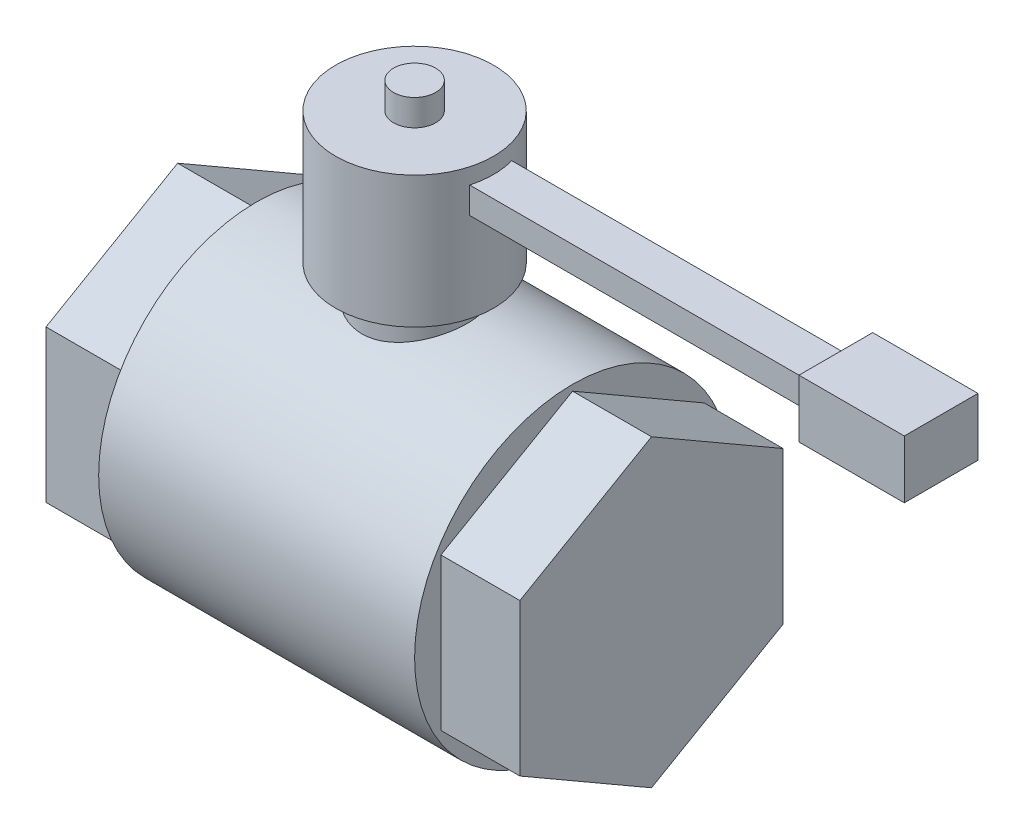
ISO-10303-21;
HEADER;
FILE_DESCRIPTION(('STEP AP214'),'2;1');
FILE_NAME('part.step','',(''),(''),'','','');
FILE_SCHEMA(('AUTOMOTIVE_DESIGN { 1 0 10303 214 1 1 1 1 }'));
ENDSEC;
DATA;
#1=APPLICATION_CONTEXT('core data for automotive mechanical design processes');
#2=APPLICATION_PROTOCOL_DEFINITION('international standard','automotive_design',2000,#1);
#3=PRODUCT_CONTEXT('',#1,'mechanical');
#4=PRODUCT('Part','Part','',(#3));
#5=PRODUCT_RELATED_PRODUCT_CATEGORY('part','',(#4));
#6=PRODUCT_DEFINITION_FORMATION('','',#4);
#7=PRODUCT_DEFINITION_CONTEXT('part definition',#1,'design');
#8=PRODUCT_DEFINITION('design','',#6,#7);
#9=PRODUCT_DEFINITION_SHAPE('','',#8);
#10=(LENGTH_UNIT() NAMED_UNIT(*) SI_UNIT(.MILLI.,.METRE.));
#11=(NAMED_UNIT(*) PLANE_ANGLE_UNIT() SI_UNIT($,.RADIAN.));
#12=(NAMED_UNIT(*) SI_UNIT($,.STERADIAN.) SOLID_ANGLE_UNIT());
#13=UNCERTAINTY_MEASURE_WITH_UNIT(LENGTH_MEASURE(1.E-05),#10,'distance_accuracy_value','');
#14=(GEOMETRIC_REPRESENTATION_CONTEXT(3) GLOBAL_UNCERTAINTY_ASSIGNED_CONTEXT((#13)) GLOBAL_UNIT_ASSIGNED_CONTEXT((#10,
#11,#12)) REPRESENTATION_CONTEXT('',''));
#15=CARTESIAN_POINT('',(0.,0.,0.));
#16=DIRECTION('',(0.,0.,1.));
#17=DIRECTION('',(1.,0.,0.));
#18=AXIS2_PLACEMENT_3D('',#15,#16,#17);
#19=CARTESIAN_POINT('',(-30.,60.,0.));
#20=DIRECTION('',(0.,-1.,0.));
#21=DIRECTION('',(0.,0.,-1.));
#22=AXIS2_PLACEMENT_3D('',#19,#20,#21);
#23=CYLINDRICAL_SURFACE('',#22,15.);
#24=CARTESIAN_POINT('',(-30.,35.,0.));
#25=DIRECTION('',(0.,1.,0.));
#26=DIRECTION('',(0.,0.,1.));
#27=AXIS2_PLACEMENT_3D('',#24,#25,#26);
#28=CIRCLE('',#27,15.);
#29=CARTESIAN_POINT('',(-30.,35.,15.));
#30=VERTEX_POINT('',#29);
#31=EDGE_CURVE('E234',#30,#30,#28,.T.);
#32=ORIENTED_EDGE('',*,*,#31,.T.);
#33=EDGE_LOOP('',(#32));
#34=FACE_BOUND('',#33,.T.);
#35=CARTESIAN_POINT('',(-30.,60.,0.));
#36=DIRECTION('',(0.,1.,0.));
#37=DIRECTION('',(0.,0.,1.));
#38=AXIS2_PLACEMENT_3D('',#35,#36,#37);
#39=CIRCLE('',#38,15.);
#40=CARTESIAN_POINT('',(-30.,60.,15.));
#41=VERTEX_POINT('',#40);
#42=EDGE_CURVE('E237',#41,#41,#39,.T.);
#43=ORIENTED_EDGE('',*,*,#42,.F.);
#44=EDGE_LOOP('',(#43));
#45=FACE_BOUND('',#44,.T.);
#46=DIRECTION('',(0.,-1.,0.));
#47=VECTOR('',#46,1.);
#48=CARTESIAN_POINT('',(-15.543167705199,60.,4.));
#49=LINE('',#48,#47);
#50=CARTESIAN_POINT('',(-15.543167705199,57.,4.));
#51=VERTEX_POINT('',#50);
#52=CARTESIAN_POINT('',(-15.543167705199,52.,4.));
#53=VERTEX_POINT('',#52);
#54=EDGE_CURVE('E45',#51,#53,#49,.T.);
#55=ORIENTED_EDGE('',*,*,#54,.F.);
#56=CARTESIAN_POINT('',(-30.,57.,0.));
#57=DIRECTION('',(0.,-1.,0.));
#58=DIRECTION('',(0.,0.,-1.));
#59=AXIS2_PLACEMENT_3D('',#56,#57,#58);
#60=CIRCLE('',#59,15.);
#61=CARTESIAN_POINT('',(-15.543167705199,57.,-4.));
#62=VERTEX_POINT('',#61);
#63=EDGE_CURVE('E350',#62,#51,#60,.T.);
#64=ORIENTED_EDGE('',*,*,#63,.F.);
#65=DIRECTION('',(0.,-1.,0.));
#66=VECTOR('',#65,1.);
#67=CARTESIAN_POINT('',(-15.543167705199,60.,-4.));
#68=LINE('',#67,#66);
#69=CARTESIAN_POINT('',(-15.543167705199,52.,-4.));
#70=VERTEX_POINT('',#69);
#71=EDGE_CURVE('E430',#70,#62,#68,.F.);
#72=ORIENTED_EDGE('',*,*,#71,.F.);
#73=CARTESIAN_POINT('',(-30.,52.,0.));
#74=DIRECTION('',(0.,1.,0.));
#75=DIRECTION('',(0.,0.,1.));
#76=AXIS2_PLACEMENT_3D('',#73,#74,#75);
#77=CIRCLE('',#76,15.);
#78=EDGE_CURVE('E424',#53,#70,#77,.T.);
#79=ORIENTED_EDGE('',*,*,#78,.F.);
#80=EDGE_LOOP('',(#55,#64,#72,#79));
#81=FACE_BOUND('',#80,.T.);
#82=ADVANCED_FACE('F37',(#34,#45,#81),#23,.T.);
#83=CARTESIAN_POINT('',(-30.,60.,0.));
#84=DIRECTION('',(0.,1.,0.));
#85=DIRECTION('',(0.,0.,1.));
#86=AXIS2_PLACEMENT_3D('',#83,#84,#85);
#87=PLANE('',#86);
#88=ORIENTED_EDGE('',*,*,#42,.T.);
#89=EDGE_LOOP('',(#88));
#90=FACE_BOUND('',#89,.T.);
#91=CARTESIAN_POINT('',(-30.,60.,0.));
#92=DIRECTION('',(0.,1.,0.));
#93=DIRECTION('',(0.,0.,1.));
#94=AXIS2_PLACEMENT_3D('',#91,#92,#93);
#95=CIRCLE('',#94,4.00000000000001);
#96=CARTESIAN_POINT('',(-30.,60.,4.));
#97=VERTEX_POINT('',#96);
#98=EDGE_CURVE('E230',#97,#97,#95,.T.);
#99=ORIENTED_EDGE('',*,*,#98,.F.);
#100=EDGE_LOOP('',(#99));
#101=FACE_BOUND('',#100,.T.);
#102=ADVANCED_FACE('F407',(#90,#101),#87,.T.);
#103=CARTESIAN_POINT('',(-60.,0.,0.));
#104=DIRECTION('',(1.,0.,0.));
#105=DIRECTION('',(0.,0.,-1.));
#106=AXIS2_PLACEMENT_3D('',#103,#104,#105);
#107=CYLINDRICAL_SURFACE('',#106,30.);
#108=CARTESIAN_POINT('',(0.,0.,0.));
#109=DIRECTION('',(-1.,0.,0.));
#110=DIRECTION('',(0.,0.,1.));
#111=AXIS2_PLACEMENT_3D('',#108,#109,#110);
#112=CIRCLE('',#111,30.);
#113=CARTESIAN_POINT('',(0.,0.,30.));
#114=VERTEX_POINT('',#113);
#115=EDGE_CURVE('E288',#114,#114,#112,.T.);
#116=ORIENTED_EDGE('',*,*,#115,.T.);
#117=EDGE_LOOP('',(#116));
#118=FACE_BOUND('',#117,.T.);
#119=CARTESIAN_POINT('',(-60.,0.,0.));
#120=DIRECTION('',(-1.,0.,0.));
#121=DIRECTION('',(0.,0.,1.));
#122=AXIS2_PLACEMENT_3D('',#119,#120,#121);
#123=CIRCLE('',#122,30.);
#124=CARTESIAN_POINT('',(-60.,0.,30.));
#125=VERTEX_POINT('',#124);
#126=EDGE_CURVE('E289',#125,#125,#123,.T.);
#127=ORIENTED_EDGE('',*,*,#126,.F.);
#128=EDGE_LOOP('',(#127));
#129=FACE_BOUND('',#128,.T.);
#130=CARTESIAN_POINT('',(-30.,28.2842712474619,-10.));
#131=CARTESIAN_POINT('',(-30.2723418794484,28.2842711586537,-10.0000001140375));
#132=CARTESIAN_POINT('',(-30.5446821013665,28.2882153633986,-9.98886524893431));
#133=CARTESIAN_POINT('',(-31.0873201569934,28.303863864854,-9.94443775454981));
#134=CARTESIAN_POINT('',(-31.3576180054255,28.3155681055686,-9.91114528515617));
#135=CARTESIAN_POINT('',(-31.8942210460498,28.3463631817862,-9.82272262727794));
#136=CARTESIAN_POINT('',(-32.1605257092147,28.3654549871867,-9.76758957136718));
#137=CARTESIAN_POINT('',(-32.6872225140072,28.4104260085242,-9.63600126034046));
#138=CARTESIAN_POINT('',(-32.9476146047763,28.4363052828214,-9.55954582188961));
#139=CARTESIAN_POINT('',(-33.4601649850302,28.4939998192804,-9.38617562291736));
#140=CARTESIAN_POINT('',(-33.7123400970215,28.5258019239445,-9.28930615037564));
#141=CARTESIAN_POINT('',(-34.2075458741649,28.594462376809,-9.07575323466854));
#142=CARTESIAN_POINT('',(-34.4505731043534,28.6313226006317,-8.95906243763903));
#143=CARTESIAN_POINT('',(-34.9259128050748,28.7090513785684,-8.70676649822042));
#144=CARTESIAN_POINT('',(-35.1582256786273,28.749919781734,-8.57116206803915));
#145=CARTESIAN_POINT('',(-35.610819611248,28.8345602147077,-8.28195822303537));
#146=CARTESIAN_POINT('',(-35.8310999350429,28.8783324215974,-8.12835771032556));
#147=CARTESIAN_POINT('',(-36.2659723967076,28.969218118448,-7.798378664126));
#148=CARTESIAN_POINT('',(-36.4800846696936,29.0163950635917,-7.62138490453672));
#149=CARTESIAN_POINT('',(-36.8927827349914,29.1113399914068,-7.25028001156654));
#150=CARTESIAN_POINT('',(-37.0913682311173,29.1591079853326,-7.05616855180183));
#151=CARTESIAN_POINT('',(-37.4718262063634,29.2539610336928,-6.65198113288573));
#152=CARTESIAN_POINT('',(-37.6536957650044,29.3010459675826,-6.44190239572426));
#153=CARTESIAN_POINT('',(-37.999507438662,29.3932703717309,-6.00708268197571));
#154=CARTESIAN_POINT('',(-38.1634500891393,29.4384099000727,-5.78234214364379));
#155=CARTESIAN_POINT('',(-38.4763726217723,29.5266957482027,-5.31343875376167));
#156=CARTESIAN_POINT('',(-38.6248433632185,29.5697580123815,-5.06891983241567));
#157=CARTESIAN_POINT('',(-38.9005121686635,29.6513369329531,-4.56756881728999));
#158=CARTESIAN_POINT('',(-39.0277186271821,29.6898553813361,-4.31074163421874));
#159=CARTESIAN_POINT('',(-39.2598596183403,29.7612633479985,-3.78644812030809));
#160=CARTESIAN_POINT('',(-39.3647941395875,29.7941528633985,-3.51898178402669));
#161=CARTESIAN_POINT('',(-39.5514314448541,29.8533415547454,-2.97535495188021));
#162=CARTESIAN_POINT('',(-39.6331352235978,29.8796410128683,-2.6991948288397));
#163=CARTESIAN_POINT('',(-39.7700936859465,29.9240820045263,-2.15001211988425));
#164=CARTESIAN_POINT('',(-39.8261696288596,29.9424755162849,-1.87721461619439));
#165=CARTESIAN_POINT('',(-39.9154055713305,29.9718782846619,-1.32750200396553));
#166=CARTESIAN_POINT('',(-39.9485660547191,29.982887697186,-1.05058698248878));
#167=CARTESIAN_POINT('',(-39.9916376695668,29.997206705667,-0.494817637017567));
#168=CARTESIAN_POINT('',(-40.0015539546129,30.0005180084087,-0.215963756651264));
#169=CARTESIAN_POINT('',(-39.9980515692161,29.9993505006877,0.341577814177324));
#170=CARTESIAN_POINT('',(-39.9846334390276,29.9948718705828,0.620265508337825));
#171=CARTESIAN_POINT('',(-39.9355842762636,29.9785811916691,1.16440400781504));
#172=CARTESIAN_POINT('',(-39.9008464957939,29.9670641183686,1.42994475599843));
#173=CARTESIAN_POINT('',(-39.8102808468664,29.9372641152287,1.95700946299872));
#174=CARTESIAN_POINT('',(-39.754453629906,29.9189813943948,2.21853354563925));
#175=CARTESIAN_POINT('',(-39.6222095953314,29.8761277515145,2.73574967788115));
#176=CARTESIAN_POINT('',(-39.5457956920147,29.8515577195385,2.99144254740937));
#177=CARTESIAN_POINT('',(-39.3729812172166,29.7967458585561,3.49545812020525));
#178=CARTESIAN_POINT('',(-39.2765730714632,29.7665018805458,3.74377798954211));
#179=CARTESIAN_POINT('',(-39.0631917994555,29.7006905364675,4.23450728965929));
#180=CARTESIAN_POINT('',(-38.9459722462019,29.6650602399235,4.4768010652609));
#181=CARTESIAN_POINT('',(-38.6926596962516,29.5896554948147,4.95074703653144));
#182=CARTESIAN_POINT('',(-38.5565597406014,29.5498795195829,5.18239526635339));
#183=CARTESIAN_POINT('',(-38.2664583434768,29.467185279309,5.63361428175612));
#184=CARTESIAN_POINT('',(-38.1124561366853,29.4242668799581,5.85318455041525));
#185=CARTESIAN_POINT('',(-37.7875470054384,29.3363500324178,6.27899992233789));
#186=CARTESIAN_POINT('',(-37.6166394655278,29.2913515085312,6.48524454001579));
#187=CARTESIAN_POINT('',(-37.2504812155572,29.198230563107,6.89268066334408));
#188=CARTESIAN_POINT('',(-37.0544610532442,29.150061110167,7.09317055422095));
#189=CARTESIAN_POINT('',(-36.6463400613069,29.0539933119105,7.47693750407163));
#190=CARTESIAN_POINT('',(-36.4342459481895,29.0060948622484,7.66022168157001));
#191=CARTESIAN_POINT('',(-35.9950753647007,28.911847334422,8.00859996283032));
#192=CARTESIAN_POINT('',(-35.7679902657065,28.8654991721175,8.17368344194966));
#193=CARTESIAN_POINT('',(-35.3004330666849,28.775718676331,8.4843478027125));
#194=CARTESIAN_POINT('',(-35.0599663269053,28.7322851904866,8.62993641488595));
#195=CARTESIAN_POINT('',(-34.5634279368337,28.64898095839,8.90261331003136));
#196=CARTESIAN_POINT('',(-34.3071784802907,28.6091721838022,9.02939717143143));
#197=CARTESIAN_POINT('',(-33.7841885696666,28.5351208009343,9.26075808434889));
#198=CARTESIAN_POINT('',(-33.5174525258998,28.5008758831323,9.36534435549717));
#199=CARTESIAN_POINT('',(-32.9753195591193,28.439058164449,9.55141833409385));
#200=CARTESIAN_POINT('',(-32.699923754345,28.4114845060698,9.63290901039166));
#201=CARTESIAN_POINT('',(-32.1425234064101,28.3639441097449,9.77200545725045));
#202=CARTESIAN_POINT('',(-31.8605192048755,28.3439769794908,9.8296124596308));
#203=CARTESIAN_POINT('',(-31.3049734673768,28.3130630141317,9.9182943720193));
#204=CARTESIAN_POINT('',(-31.0316243645171,28.3017497645433,9.95044933424631));
#205=CARTESIAN_POINT('',(-30.4829950763864,28.287066021394,9.99211639711498));
#206=CARTESIAN_POINT('',(-30.2077149493872,28.2836952891803,10.0016291780981));
#207=CARTESIAN_POINT('',(-29.6573740214749,28.2850080810155,9.9979157921081));
#208=CARTESIAN_POINT('',(-29.3823131922071,28.2896902973743,9.98469331703369));
#209=CARTESIAN_POINT('',(-28.8344674952236,28.3069515740732,9.9356512804711));
#210=CARTESIAN_POINT('',(-28.5616825995672,28.3195305373233,9.89983199680915));
#211=CARTESIAN_POINT('',(-28.0298042567512,28.3516074081319,9.80758102183027));
#212=CARTESIAN_POINT('',(-27.7705637013315,28.3708507880741,9.75190561796518));
#213=CARTESIAN_POINT('',(-27.2577495174967,28.4157468336444,9.62029948519906));
#214=CARTESIAN_POINT('',(-27.0041779311515,28.4414017695639,9.54436158082836));
#215=CARTESIAN_POINT('',(-26.5044799532182,28.4983692386223,9.37289185459437));
#216=CARTESIAN_POINT('',(-26.2583517989269,28.529680419844,9.27736471408097));
#217=CARTESIAN_POINT('',(-25.7748737754284,28.597103970113,9.0674030758055));
#218=CARTESIAN_POINT('',(-25.5375273417895,28.6332181933345,8.95296127203323));
#219=CARTESIAN_POINT('',(-25.0658014476826,28.710459557941,8.70214104644034));
#220=CARTESIAN_POINT('',(-24.8317473188572,28.7517082135721,8.56518817614671));
#221=CARTESIAN_POINT('',(-24.3758018385612,28.8371535148024,8.27295319484451));
#222=CARTESIAN_POINT('',(-24.1539159958621,28.8813514758506,8.11766288088269));
#223=CARTESIAN_POINT('',(-23.7236756816311,28.9715031084024,7.78979500724484));
#224=CARTESIAN_POINT('',(-23.5153217343163,29.0174568478141,7.61721677850365));
#225=CARTESIAN_POINT('',(-23.1133393005839,29.1099265934175,7.25582239580804));
#226=CARTESIAN_POINT('',(-22.9197111556612,29.1564426126195,7.06700586549977));
#227=CARTESIAN_POINT('',(-22.5393176180589,29.2510891603461,6.66472112704177));
#228=CARTESIAN_POINT('',(-22.3533374618238,29.2991889216562,6.45050221786745));
#229=CARTESIAN_POINT('',(-22.0001149407249,29.3933527827565,6.00684695000576));
#230=CARTESIAN_POINT('',(-21.8328658410932,29.4394176105782,5.77741610832449));
#231=CARTESIAN_POINT('',(-21.5181558106606,29.5282725260609,5.30461980440384));
#232=CARTESIAN_POINT('',(-21.3707026844815,29.5710613192953,5.06124889988544));
#233=CARTESIAN_POINT('',(-21.0968569085151,29.6521306466086,4.56234364098344));
#234=CARTESIAN_POINT('',(-20.970455395478,29.6904130759775,4.30681446409061));
#235=CARTESIAN_POINT('',(-20.7404305230089,29.7611781009394,3.78690590920505));
#236=CARTESIAN_POINT('',(-20.6366666176068,29.7936962331654,3.52259360643661));
#237=CARTESIAN_POINT('',(-20.4518195802299,29.8523040878082,2.98545108537337));
#238=CARTESIAN_POINT('',(-20.3707364736991,29.8783938030133,2.71262085752323));
#239=CARTESIAN_POINT('',(-20.2320439705428,29.9233798042343,2.16055813778271));
#240=CARTESIAN_POINT('',(-20.1744275615284,29.9422782390591,1.88132758484044));
#241=CARTESIAN_POINT('',(-20.0832142576388,29.9723335559029,1.31856201646018));
#242=CARTESIAN_POINT('',(-20.0496163286901,29.983490771206,1.03502718687206));
#243=CARTESIAN_POINT('',(-20.0077927119217,29.9973972888662,0.479319262582846));
#244=CARTESIAN_POINT('',(-19.9984478955139,30.0005173987915,0.20723908105294));
#245=CARTESIAN_POINT('',(-20.0019714741259,29.9993428126327,-0.336755914294548));
#246=CARTESIAN_POINT('',(-20.0148391277196,29.9950483640377,-0.608670733328677));
#247=CARTESIAN_POINT('',(-20.0626613555054,29.9791626520563,-1.15030993875714));
#248=CARTESIAN_POINT('',(-20.0976141388509,29.9675719803088,-1.42003450095977));
#249=CARTESIAN_POINT('',(-20.1892760283218,29.9374086079629,-1.95536187856338));
#250=CARTESIAN_POINT('',(-20.2459851902558,29.9188358894545,-2.22096468338958));
#251=CARTESIAN_POINT('',(-20.3795575535406,29.8755584356358,-2.74194020770653));
#252=CARTESIAN_POINT('',(-20.4560810580551,29.8509573983983,-2.99740882399659));
#253=CARTESIAN_POINT('',(-20.6290813713709,29.7960968484284,-3.50096941131779));
#254=CARTESIAN_POINT('',(-20.7255652896824,29.7658353199086,-3.7490587178722));
#255=CARTESIAN_POINT('',(-20.9377063033215,29.7004207309351,-4.23620216269844));
#256=CARTESIAN_POINT('',(-21.0533620444964,29.6652680159862,-4.47525693763802));
#257=CARTESIAN_POINT('',(-21.3030139795065,29.5909339126644,-4.94294527905783));
#258=CARTESIAN_POINT('',(-21.4370113601066,29.551752263647,-5.1715781699306));
#259=CARTESIAN_POINT('',(-21.7277108863564,29.4688081519004,-5.62534353485784));
#260=CARTESIAN_POINT('',(-21.8850687990776,29.4249299528017,-5.85003487702622));
#261=CARTESIAN_POINT('',(-22.2174631447937,29.3350010427051,-6.28547126835551));
#262=CARTESIAN_POINT('',(-22.3924999321698,29.2889502881672,-6.49621603781055));
#263=CARTESIAN_POINT('',(-22.7591991680803,29.1958514949471,-6.90258840131869));
#264=CARTESIAN_POINT('',(-22.9508666337529,29.148803158572,-7.09821139954937));
#265=CARTESIAN_POINT('',(-23.3496217678836,29.0549477346299,-7.47310912970469));
#266=CARTESIAN_POINT('',(-23.5567093046823,29.0081406450066,-7.65238400118341));
#267=CARTESIAN_POINT('',(-23.9935507015225,28.914186301541,-8.00022249753155));
#268=CARTESIAN_POINT('',(-24.2238763492309,28.8670984170591,-8.16808498152002));
#269=CARTESIAN_POINT('',(-24.6983400025417,28.7759175566601,-8.48372301205399));
#270=CARTESIAN_POINT('',(-24.9424728089149,28.7318234669818,-8.63150604933306));
#271=CARTESIAN_POINT('',(-25.4430577217519,28.6479466892045,-8.90593894197784));
#272=CARTESIAN_POINT('',(-25.6995098377129,28.6081640044294,-9.03258878105097));
#273=CARTESIAN_POINT('',(-26.2229973529307,28.5341661028133,-9.26369799840207));
#274=CARTESIAN_POINT('',(-26.4900321839124,28.4999505875266,-9.36815856629792));
#275=CARTESIAN_POINT('',(-27.0205145149407,28.439603815985,-9.54974733148494));
#276=CARTESIAN_POINT('',(-27.2835787908005,28.4131771013528,-9.62789736827418));
#277=CARTESIAN_POINT('',(-27.8158133997925,28.3672416792722,-9.76241059985781));
#278=CARTESIAN_POINT('',(-28.0849835205205,28.3477327315668,-9.8187745512985));
#279=CARTESIAN_POINT('',(-28.6274076768933,28.3162626414064,-9.90916574585985));
#280=CARTESIAN_POINT('',(-28.9006604964561,28.304299295539,-9.94319950979859));
#281=CARTESIAN_POINT('',(-29.4492761144348,28.2883036592247,-9.98861653420382));
#282=CARTESIAN_POINT('',(-29.72463890446,28.2842713372547,-9.99999988469829));
#283=CARTESIAN_POINT('',(-30.,28.2842712474619,-10.));
#284=B_SPLINE_CURVE_WITH_KNOTS('',3,(#130,#131,#132,#133,#134,#135,#136,#137,#138,#139,#140,
#141,#142,#143,#144,#145,#146,#147,#148,#149,#150,#151,#152,#153,#154,#155,#156,#157,#158,#159,
#160,#161,#162,#163,#164,#165,#166,#167,#168,#169,#170,#171,#172,#173,#174,#175,#176,#177,#178,
#179,#180,#181,#182,#183,#184,#185,#186,#187,#188,#189,#190,#191,#192,#193,#194,#195,#196,#197,
#198,#199,#200,#201,#202,#203,#204,#205,#206,#207,#208,#209,#210,#211,#212,#213,#214,#215,#216,
#217,#218,#219,#220,#221,#222,#223,#224,#225,#226,#227,#228,#229,#230,#231,#232,#233,#234,#235,
#236,#237,#238,#239,#240,#241,#242,#243,#244,#245,#246,#247,#248,#249,#250,#251,#252,#253,#254,
#255,#256,#257,#258,#259,#260,#261,#262,#263,#264,#265,#266,#267,#268,#269,#270,#271,#272,#273,
#274,#275,#276,#277,#278,#279,#280,#281,#282,#283),.UNSPECIFIED.,.T.,.F.,(4,2,2,2,2,2,2,2,2,2,2,
2,2,2,2,2,2,2,2,2,2,2,2,2,2,2,2,2,2,2,2,2,2,2,2,2,2,2,2,2,2,2,2,2,2,2,2,2,2,2,2,2,2,2,2,2,2,2,2,
2,2,2,2,2,2,2,2,2,2,2,2,2,2,2,2,2,4),(0.,0.816768059607217,1.63353022553851,2.4503996588184,
3.26727611595184,4.08235908130451,4.89774511187016,5.71310044671446,6.52850554988107,
7.37286999592243,8.21725054497379,9.06177833834293,9.90628089953094,10.7730733994816,
11.6395229027309,12.5059728491808,13.3723856892507,14.208656653563,15.0449099605402,
15.8809778400841,16.7170263626666,17.5202339571185,18.3234167408122,19.1264858838399,
19.9298598051697,20.74347212296,21.5573851233426,22.3713329311248,23.1853103823888,
24.0378278398089,24.889991015934,25.7426490367816,26.5949679354003,27.459853568185,
28.3243792700685,29.1887937900586,30.0531637216384,30.8785251225923,31.7038617231671,
32.5290643128742,33.3542567569691,34.1508897973456,34.9478053211232,35.7445306229922,
36.5415643916546,37.3635426098909,38.1858899294866,39.0082690873153,39.8306673105009,
40.6928533438219,41.5547283753545,42.4169422120339,43.2787921126043,44.1351284875122,
44.9914658230858,45.8475470772925,46.7035914722059,47.5193689812693,48.3351192611683,
49.1508034017132,49.9664896346322,50.7690241262024,51.5718449585706,52.3746091098772,
53.1774252272562,54.009891165582,54.8423737943937,55.6751084453734,56.507835987135,
57.3734004329109,58.2386410839164,59.1038824019739,59.9690773207395,60.795173483065,
61.621240951903,62.44706708663,63.2728899389621),.UNSPECIFIED.);
#285=CARTESIAN_POINT('',(-30.,28.2842712474619,-10.));
#286=VERTEX_POINT('',#285);
#287=EDGE_CURVE('E343',#286,#286,#284,.T.);
#288=ORIENTED_EDGE('',*,*,#287,.F.);
#289=EDGE_LOOP('',(#288));
#290=FACE_BOUND('',#289,.T.);
#291=ADVANCED_FACE('F352',(#118,#129,#290),#107,.T.);
#292=CARTESIAN_POINT('',(-60.,0.,0.));
#293=DIRECTION('',(-1.,0.,0.));
#294=DIRECTION('',(0.,0.,1.));
#295=AXIS2_PLACEMENT_3D('',#292,#293,#294);
#296=PLANE('',#295);
#297=ORIENTED_EDGE('',*,*,#126,.T.);
#298=EDGE_LOOP('',(#297));
#299=FACE_BOUND('',#298,.T.);
#300=DIRECTION('',(0.,-0.5,-0.866025403784439));
#301=VECTOR('',#300,1.);
#302=CARTESIAN_POINT('',(-60.,28.8675134594813,0.));
#303=LINE('',#302,#301);
#304=CARTESIAN_POINT('',(-60.,28.8675134594813,0.));
#305=VERTEX_POINT('',#304);
#306=CARTESIAN_POINT('',(-60.,14.4337567297407,-25.));
#307=VERTEX_POINT('',#306);
#308=EDGE_CURVE('E263',#305,#307,#303,.T.);
#309=ORIENTED_EDGE('',*,*,#308,.F.);
#310=DIRECTION('',(0.,0.5,-0.866025403784439));
#311=VECTOR('',#310,1.);
#312=CARTESIAN_POINT('',(-60.,14.4337567297406,25.));
#313=LINE('',#312,#311);
#314=CARTESIAN_POINT('',(-60.,14.4337567297406,25.));
#315=VERTEX_POINT('',#314);
#316=EDGE_CURVE('E245',#315,#305,#313,.T.);
#317=ORIENTED_EDGE('',*,*,#316,.F.);
#318=DIRECTION('',(0.,1.,0.));
#319=VECTOR('',#318,1.);
#320=CARTESIAN_POINT('',(-60.,-14.4337567297407,25.));
#321=LINE('',#320,#319);
#322=CARTESIAN_POINT('',(-60.,-14.4337567297407,25.));
#323=VERTEX_POINT('',#322);
#324=EDGE_CURVE('E250',#323,#315,#321,.T.);
#325=ORIENTED_EDGE('',*,*,#324,.F.);
#326=DIRECTION('',(0.,0.5,0.866025403784439));
#327=VECTOR('',#326,1.);
#328=CARTESIAN_POINT('',(-60.,-28.8675134594813,0.));
#329=LINE('',#328,#327);
#330=CARTESIAN_POINT('',(-60.,-28.8675134594813,0.));
#331=VERTEX_POINT('',#330);
#332=EDGE_CURVE('E269',#331,#323,#329,.T.);
#333=ORIENTED_EDGE('',*,*,#332,.F.);
#334=DIRECTION('',(0.,-0.5,0.866025403784439));
#335=VECTOR('',#334,1.);
#336=CARTESIAN_POINT('',(-60.,-14.4337567297407,-25.));
#337=LINE('',#336,#335);
#338=CARTESIAN_POINT('',(-60.,-14.4337567297407,-25.));
#339=VERTEX_POINT('',#338);
#340=EDGE_CURVE('E267',#339,#331,#337,.T.);
#341=ORIENTED_EDGE('',*,*,#340,.F.);
#342=DIRECTION('',(0.,-1.,0.));
#343=VECTOR('',#342,1.);
#344=CARTESIAN_POINT('',(-60.,14.4337567297407,-25.));
#345=LINE('',#344,#343);
#346=EDGE_CURVE('E265',#307,#339,#345,.T.);
#347=ORIENTED_EDGE('',*,*,#346,.F.);
#348=EDGE_LOOP('',(#309,#317,#325,#333,#341,#347));
#349=FACE_BOUND('',#348,.T.);
#350=ADVANCED_FACE('F393',(#299,#349),#296,.T.);
#351=CARTESIAN_POINT('',(15.,14.4337567297407,-25.));
#352=DIRECTION('',(0.,-0.866025403784438,0.5));
#353=DIRECTION('',(0.,-0.5,-0.866025403784439));
#354=AXIS2_PLACEMENT_3D('',#351,#352,#353);
#355=PLANE('',#354);
#356=DIRECTION('',(0.,0.5,0.866025403784439));
#357=VECTOR('',#356,1.);
#358=CARTESIAN_POINT('',(0.,14.4337567297407,-25.));
#359=LINE('',#358,#357);
#360=CARTESIAN_POINT('',(0.,14.4337567297407,-25.));
#361=VERTEX_POINT('',#360);
#362=CARTESIAN_POINT('',(0.,28.8675134594813,0.));
#363=VERTEX_POINT('',#362);
#364=EDGE_CURVE('E292',#361,#363,#359,.T.);
#365=ORIENTED_EDGE('',*,*,#364,.T.);
#366=DIRECTION('',(-1.,0.,0.));
#367=VECTOR('',#366,1.);
#368=CARTESIAN_POINT('',(15.,28.8675134594813,0.));
#369=LINE('',#368,#367);
#370=CARTESIAN_POINT('',(15.,28.8675134594813,0.));
#371=VERTEX_POINT('',#370);
#372=EDGE_CURVE('E340',#371,#363,#369,.T.);
#373=ORIENTED_EDGE('',*,*,#372,.F.);
#374=DIRECTION('',(0.,0.5,0.866025403784439));
#375=VECTOR('',#374,1.);
#376=CARTESIAN_POINT('',(15.,14.4337567297407,-25.));
#377=LINE('',#376,#375);
#378=CARTESIAN_POINT('',(15.,14.4337567297407,-25.));
#379=VERTEX_POINT('',#378);
#380=EDGE_CURVE('E295',#379,#371,#377,.T.);
#381=ORIENTED_EDGE('',*,*,#380,.F.);
#382=DIRECTION('',(-1.,0.,0.));
#383=VECTOR('',#382,1.);
#384=CARTESIAN_POINT('',(15.,14.4337567297407,-25.));
#385=LINE('',#384,#383);
#386=EDGE_CURVE('E309',#379,#361,#385,.T.);
#387=ORIENTED_EDGE('',*,*,#386,.T.);
#388=EDGE_LOOP('',(#365,#373,#381,#387));
#389=FACE_BOUND('',#388,.T.);
#390=ADVANCED_FACE('F39',(#389),#355,.F.);
#391=CARTESIAN_POINT('',(15.,28.8675134594813,0.));
#392=DIRECTION('',(0.,-0.866025403784439,-0.5));
#393=DIRECTION('',(0.,0.5,-0.866025403784439));
#394=AXIS2_PLACEMENT_3D('',#391,#392,#393);
#395=PLANE('',#394);
#396=DIRECTION('',(0.,-0.5,0.866025403784439));
#397=VECTOR('',#396,1.);
#398=CARTESIAN_POINT('',(0.,28.8675134594813,0.));
#399=LINE('',#398,#397);
#400=CARTESIAN_POINT('',(0.,14.4337567297407,25.));
#401=VERTEX_POINT('',#400);
#402=EDGE_CURVE('E312',#363,#401,#399,.T.);
#403=ORIENTED_EDGE('',*,*,#402,.T.);
#404=DIRECTION('',(-1.,0.,0.));
#405=VECTOR('',#404,1.);
#406=CARTESIAN_POINT('',(15.,14.4337567297407,25.));
#407=LINE('',#406,#405);
#408=CARTESIAN_POINT('',(15.,14.4337567297407,25.));
#409=VERTEX_POINT('',#408);
#410=EDGE_CURVE('E337',#409,#401,#407,.T.);
#411=ORIENTED_EDGE('',*,*,#410,.F.);
#412=DIRECTION('',(0.,-0.5,0.866025403784439));
#413=VECTOR('',#412,1.);
#414=CARTESIAN_POINT('',(15.,28.8675134594813,0.));
#415=LINE('',#414,#413);
#416=EDGE_CURVE('E298',#371,#409,#415,.T.);
#417=ORIENTED_EDGE('',*,*,#416,.F.);
#418=ORIENTED_EDGE('',*,*,#372,.T.);
#419=EDGE_LOOP('',(#403,#411,#417,#418));
#420=FACE_BOUND('',#419,.T.);
#421=ADVANCED_FACE('F504',(#420),#395,.F.);
#422=CARTESIAN_POINT('',(15.,14.4337567297407,25.));
#423=DIRECTION('',(0.,0.,-1.));
#424=DIRECTION('',(-1.,0.,0.));
#425=AXIS2_PLACEMENT_3D('',#422,#423,#424);
#426=PLANE('',#425);
#427=DIRECTION('',(0.,-1.,0.));
#428=VECTOR('',#427,1.);
#429=CARTESIAN_POINT('',(0.,14.4337567297407,25.));
#430=LINE('',#429,#428);
#431=CARTESIAN_POINT('',(0.,-14.4337567297406,25.));
#432=VERTEX_POINT('',#431);
#433=EDGE_CURVE('E315',#401,#432,#430,.T.);
#434=ORIENTED_EDGE('',*,*,#433,.T.);
#435=DIRECTION('',(-1.,0.,0.));
#436=VECTOR('',#435,1.);
#437=CARTESIAN_POINT('',(15.,-14.4337567297406,25.));
#438=LINE('',#437,#436);
#439=CARTESIAN_POINT('',(15.,-14.4337567297406,25.));
#440=VERTEX_POINT('',#439);
#441=EDGE_CURVE('E334',#440,#432,#438,.T.);
#442=ORIENTED_EDGE('',*,*,#441,.F.);
#443=DIRECTION('',(0.,-1.,0.));
#444=VECTOR('',#443,1.);
#445=CARTESIAN_POINT('',(15.,14.4337567297407,25.));
#446=LINE('',#445,#444);
#447=EDGE_CURVE('E301',#409,#440,#446,.T.);
#448=ORIENTED_EDGE('',*,*,#447,.F.);
#449=ORIENTED_EDGE('',*,*,#410,.T.);
#450=EDGE_LOOP('',(#434,#442,#448,#449));
#451=FACE_BOUND('',#450,.T.);
#452=ADVANCED_FACE('F512',(#451),#426,.F.);
#453=CARTESIAN_POINT('',(15.,-14.4337567297406,25.));
#454=DIRECTION('',(0.,0.866025403784438,-0.5));
#455=DIRECTION('',(0.,0.5,0.866025403784439));
#456=AXIS2_PLACEMENT_3D('',#453,#454,#455);
#457=PLANE('',#456);
#458=DIRECTION('',(0.,-0.5,-0.866025403784439));
#459=VECTOR('',#458,1.);
#460=CARTESIAN_POINT('',(0.,-14.4337567297406,25.));
#461=LINE('',#460,#459);
#462=CARTESIAN_POINT('',(0.,-28.8675134594813,0.));
#463=VERTEX_POINT('',#462);
#464=EDGE_CURVE('E318',#432,#463,#461,.T.);
#465=ORIENTED_EDGE('',*,*,#464,.T.);
#466=DIRECTION('',(-1.,0.,0.));
#467=VECTOR('',#466,1.);
#468=CARTESIAN_POINT('',(15.,-28.8675134594813,0.));
#469=LINE('',#468,#467);
#470=CARTESIAN_POINT('',(15.,-28.8675134594813,0.));
#471=VERTEX_POINT('',#470);
#472=EDGE_CURVE('E331',#471,#463,#469,.T.);
#473=ORIENTED_EDGE('',*,*,#472,.F.);
#474=DIRECTION('',(0.,-0.5,-0.866025403784439));
#475=VECTOR('',#474,1.);
#476=CARTESIAN_POINT('',(15.,-14.4337567297406,25.));
#477=LINE('',#476,#475);
#478=EDGE_CURVE('E303',#440,#471,#477,.T.);
#479=ORIENTED_EDGE('',*,*,#478,.F.);
#480=ORIENTED_EDGE('',*,*,#441,.T.);
#481=EDGE_LOOP('',(#465,#473,#479,#480));
#482=FACE_BOUND('',#481,.T.);
#483=ADVANCED_FACE('F519',(#482),#457,.F.);
#484=CARTESIAN_POINT('',(15.,-28.8675134594813,0.));
#485=DIRECTION('',(0.,0.866025403784439,0.5));
#486=DIRECTION('',(0.,-0.5,0.866025403784439));
#487=AXIS2_PLACEMENT_3D('',#484,#485,#486);
#488=PLANE('',#487);
#489=DIRECTION('',(0.,0.5,-0.866025403784439));
#490=VECTOR('',#489,1.);
#491=CARTESIAN_POINT('',(0.,-28.8675134594813,0.));
#492=LINE('',#491,#490);
#493=CARTESIAN_POINT('',(0.,-14.4337567297407,-25.));
#494=VERTEX_POINT('',#493);
#495=EDGE_CURVE('E321',#463,#494,#492,.T.);
#496=ORIENTED_EDGE('',*,*,#495,.T.);
#497=DIRECTION('',(-1.,0.,0.));
#498=VECTOR('',#497,1.);
#499=CARTESIAN_POINT('',(15.,-14.4337567297407,-25.));
#500=LINE('',#499,#498);
#501=CARTESIAN_POINT('',(15.,-14.4337567297407,-25.));
#502=VERTEX_POINT('',#501);
#503=EDGE_CURVE('E328',#502,#494,#500,.T.);
#504=ORIENTED_EDGE('',*,*,#503,.F.);
#505=DIRECTION('',(0.,0.5,-0.866025403784439));
#506=VECTOR('',#505,1.);
#507=CARTESIAN_POINT('',(15.,-28.8675134594813,0.));
#508=LINE('',#507,#506);
#509=EDGE_CURVE('E305',#471,#502,#508,.T.);
#510=ORIENTED_EDGE('',*,*,#509,.F.);
#511=ORIENTED_EDGE('',*,*,#472,.T.);
#512=EDGE_LOOP('',(#496,#504,#510,#511));
#513=FACE_BOUND('',#512,.T.);
#514=ADVANCED_FACE('F527',(#513),#488,.F.);
#515=CARTESIAN_POINT('',(15.,-14.4337567297407,-25.));
#516=DIRECTION('',(0.,0.,1.));
#517=DIRECTION('',(0.,-1.,0.));
#518=AXIS2_PLACEMENT_3D('',#515,#516,#517);
#519=PLANE('',#518);
#520=DIRECTION('',(0.,1.,0.));
#521=VECTOR('',#520,1.);
#522=CARTESIAN_POINT('',(0.,-14.4337567297407,-25.));
#523=LINE('',#522,#521);
#524=EDGE_CURVE('E299',#494,#361,#523,.T.);
#525=ORIENTED_EDGE('',*,*,#524,.T.);
#526=ORIENTED_EDGE('',*,*,#386,.F.);
#527=DIRECTION('',(0.,1.,0.));
#528=VECTOR('',#527,1.);
#529=CARTESIAN_POINT('',(15.,-14.4337567297407,-25.));
#530=LINE('',#529,#528);
#531=EDGE_CURVE('E307',#502,#379,#530,.T.);
#532=ORIENTED_EDGE('',*,*,#531,.F.);
#533=ORIENTED_EDGE('',*,*,#503,.T.);
#534=EDGE_LOOP('',(#525,#526,#532,#533));
#535=FACE_BOUND('',#534,.T.);
#536=ADVANCED_FACE('F402',(#535),#519,.F.);
#537=CARTESIAN_POINT('',(15.,43.301270189222,25.));
#538=DIRECTION('',(1.,0.,0.));
#539=DIRECTION('',(0.,0.,-1.));
#540=AXIS2_PLACEMENT_3D('',#537,#538,#539);
#541=PLANE('',#540);
#542=ORIENTED_EDGE('',*,*,#380,.T.);
#543=ORIENTED_EDGE('',*,*,#416,.T.);
#544=ORIENTED_EDGE('',*,*,#447,.T.);
#545=ORIENTED_EDGE('',*,*,#478,.T.);
#546=ORIENTED_EDGE('',*,*,#509,.T.);
#547=ORIENTED_EDGE('',*,*,#531,.T.);
#548=EDGE_LOOP('',(#542,#543,#544,#545,#546,#547));
#549=FACE_BOUND('',#548,.T.);
#550=ADVANCED_FACE('F397',(#549),#541,.T.);
#551=CARTESIAN_POINT('',(0.,0.,0.));
#552=DIRECTION('',(-1.,0.,0.));
#553=DIRECTION('',(0.,0.,1.));
#554=AXIS2_PLACEMENT_3D('',#551,#552,#553);
#555=PLANE('',#554);
#556=ORIENTED_EDGE('',*,*,#115,.F.);
#557=EDGE_LOOP('',(#556));
#558=FACE_BOUND('',#557,.T.);
#559=ORIENTED_EDGE('',*,*,#402,.F.);
#560=ORIENTED_EDGE('',*,*,#364,.F.);
#561=ORIENTED_EDGE('',*,*,#524,.F.);
#562=ORIENTED_EDGE('',*,*,#495,.F.);
#563=ORIENTED_EDGE('',*,*,#464,.F.);
#564=ORIENTED_EDGE('',*,*,#433,.F.);
#565=EDGE_LOOP('',(#559,#560,#561,#562,#563,#564));
#566=FACE_BOUND('',#565,.T.);
#567=ADVANCED_FACE('F391',(#558,#566),#555,.F.);
#568=CARTESIAN_POINT('',(-75.,14.4337567297406,25.));
#569=DIRECTION('',(0.,-0.866025403784439,-0.5));
#570=DIRECTION('',(0.,0.5,-0.866025403784439));
#571=AXIS2_PLACEMENT_3D('',#568,#569,#570);
#572=PLANE('',#571);
#573=ORIENTED_EDGE('',*,*,#316,.T.);
#574=DIRECTION('',(1.,0.,0.));
#575=VECTOR('',#574,1.);
#576=CARTESIAN_POINT('',(-75.,28.8675134594813,0.));
#577=LINE('',#576,#575);
#578=CARTESIAN_POINT('',(-75.,28.8675134594813,0.));
#579=VERTEX_POINT('',#578);
#580=EDGE_CURVE('E286',#579,#305,#577,.T.);
#581=ORIENTED_EDGE('',*,*,#580,.F.);
#582=DIRECTION('',(0.,0.5,-0.866025403784439));
#583=VECTOR('',#582,1.);
#584=CARTESIAN_POINT('',(-75.,14.4337567297406,25.));
#585=LINE('',#584,#583);
#586=CARTESIAN_POINT('',(-75.,14.4337567297406,25.));
#587=VERTEX_POINT('',#586);
#588=EDGE_CURVE('E246',#587,#579,#585,.T.);
#589=ORIENTED_EDGE('',*,*,#588,.F.);
#590=DIRECTION('',(1.,0.,0.));
#591=VECTOR('',#590,1.);
#592=CARTESIAN_POINT('',(-75.,14.4337567297406,25.));
#593=LINE('',#592,#591);
#594=EDGE_CURVE('E260',#587,#315,#593,.T.);
#595=ORIENTED_EDGE('',*,*,#594,.T.);
#596=EDGE_LOOP('',(#573,#581,#589,#595));
#597=FACE_BOUND('',#596,.T.);
#598=ADVANCED_FACE('F387',(#597),#572,.F.);
#599=CARTESIAN_POINT('',(-75.,28.8675134594813,0.));
#600=DIRECTION('',(0.,-0.866025403784438,0.5));
#601=DIRECTION('',(0.,-0.5,-0.866025403784439));
#602=AXIS2_PLACEMENT_3D('',#599,#600,#601);
#603=PLANE('',#602);
#604=ORIENTED_EDGE('',*,*,#308,.T.);
#605=DIRECTION('',(1.,0.,0.));
#606=VECTOR('',#605,1.);
#607=CARTESIAN_POINT('',(-75.,14.4337567297407,-25.));
#608=LINE('',#607,#606);
#609=CARTESIAN_POINT('',(-75.,14.4337567297407,-25.));
#610=VERTEX_POINT('',#609);
#611=EDGE_CURVE('E283',#610,#307,#608,.T.);
#612=ORIENTED_EDGE('',*,*,#611,.F.);
#613=DIRECTION('',(0.,-0.5,-0.866025403784439));
#614=VECTOR('',#613,1.);
#615=CARTESIAN_POINT('',(-75.,28.8675134594813,0.));
#616=LINE('',#615,#614);
#617=EDGE_CURVE('E249',#579,#610,#616,.T.);
#618=ORIENTED_EDGE('',*,*,#617,.F.);
#619=ORIENTED_EDGE('',*,*,#580,.T.);
#620=EDGE_LOOP('',(#604,#612,#618,#619));
#621=FACE_BOUND('',#620,.T.);
#622=ADVANCED_FACE('F383',(#621),#603,.F.);
#623=CARTESIAN_POINT('',(-75.,14.4337567297407,-25.));
#624=DIRECTION('',(0.,0.,1.));
#625=DIRECTION('',(0.,-1.,0.));
#626=AXIS2_PLACEMENT_3D('',#623,#624,#625);
#627=PLANE('',#626);
#628=ORIENTED_EDGE('',*,*,#346,.T.);
#629=DIRECTION('',(1.,0.,0.));
#630=VECTOR('',#629,1.);
#631=CARTESIAN_POINT('',(-75.,-14.4337567297407,-25.));
#632=LINE('',#631,#630);
#633=CARTESIAN_POINT('',(-75.,-14.4337567297407,-25.));
#634=VERTEX_POINT('',#633);
#635=EDGE_CURVE('E280',#634,#339,#632,.T.);
#636=ORIENTED_EDGE('',*,*,#635,.F.);
#637=DIRECTION('',(0.,-1.,0.));
#638=VECTOR('',#637,1.);
#639=CARTESIAN_POINT('',(-75.,14.4337567297407,-25.));
#640=LINE('',#639,#638);
#641=EDGE_CURVE('E252',#610,#634,#640,.T.);
#642=ORIENTED_EDGE('',*,*,#641,.F.);
#643=ORIENTED_EDGE('',*,*,#611,.T.);
#644=EDGE_LOOP('',(#628,#636,#642,#643));
#645=FACE_BOUND('',#644,.T.);
#646=ADVANCED_FACE('F379',(#645),#627,.F.);
#647=CARTESIAN_POINT('',(-75.,-14.4337567297407,-25.));
#648=DIRECTION('',(0.,0.866025403784438,0.5));
#649=DIRECTION('',(0.,-0.5,0.866025403784439));
#650=AXIS2_PLACEMENT_3D('',#647,#648,#649);
#651=PLANE('',#650);
#652=ORIENTED_EDGE('',*,*,#340,.T.);
#653=DIRECTION('',(1.,0.,0.));
#654=VECTOR('',#653,1.);
#655=CARTESIAN_POINT('',(-75.,-28.8675134594813,0.));
#656=LINE('',#655,#654);
#657=CARTESIAN_POINT('',(-75.,-28.8675134594813,0.));
#658=VERTEX_POINT('',#657);
#659=EDGE_CURVE('E277',#658,#331,#656,.T.);
#660=ORIENTED_EDGE('',*,*,#659,.F.);
#661=DIRECTION('',(0.,-0.5,0.866025403784439));
#662=VECTOR('',#661,1.);
#663=CARTESIAN_POINT('',(-75.,-14.4337567297407,-25.));
#664=LINE('',#663,#662);
#665=EDGE_CURVE('E254',#634,#658,#664,.T.);
#666=ORIENTED_EDGE('',*,*,#665,.F.);
#667=ORIENTED_EDGE('',*,*,#635,.T.);
#668=EDGE_LOOP('',(#652,#660,#666,#667));
#669=FACE_BOUND('',#668,.T.);
#670=ADVANCED_FACE('F375',(#669),#651,.F.);
#671=CARTESIAN_POINT('',(-75.,-28.8675134594813,0.));
#672=DIRECTION('',(0.,0.866025403784439,-0.5));
#673=DIRECTION('',(0.,0.5,0.866025403784439));
#674=AXIS2_PLACEMENT_3D('',#671,#672,#673);
#675=PLANE('',#674);
#676=ORIENTED_EDGE('',*,*,#332,.T.);
#677=DIRECTION('',(1.,0.,0.));
#678=VECTOR('',#677,1.);
#679=CARTESIAN_POINT('',(-75.,-14.4337567297407,25.));
#680=LINE('',#679,#678);
#681=CARTESIAN_POINT('',(-75.,-14.4337567297407,25.));
#682=VERTEX_POINT('',#681);
#683=EDGE_CURVE('E275',#682,#323,#680,.T.);
#684=ORIENTED_EDGE('',*,*,#683,.F.);
#685=DIRECTION('',(0.,0.5,0.866025403784439));
#686=VECTOR('',#685,1.);
#687=CARTESIAN_POINT('',(-75.,-28.8675134594813,0.));
#688=LINE('',#687,#686);
#689=EDGE_CURVE('E256',#658,#682,#688,.T.);
#690=ORIENTED_EDGE('',*,*,#689,.F.);
#691=ORIENTED_EDGE('',*,*,#659,.T.);
#692=EDGE_LOOP('',(#676,#684,#690,#691));
#693=FACE_BOUND('',#692,.T.);
#694=ADVANCED_FACE('F371',(#693),#675,.F.);
#695=CARTESIAN_POINT('',(-75.,-14.4337567297407,25.));
#696=DIRECTION('',(0.,0.,-1.));
#697=DIRECTION('',(0.,1.,0.));
#698=AXIS2_PLACEMENT_3D('',#695,#696,#697);
#699=PLANE('',#698);
#700=ORIENTED_EDGE('',*,*,#324,.T.);
#701=ORIENTED_EDGE('',*,*,#594,.F.);
#702=DIRECTION('',(0.,1.,0.));
#703=VECTOR('',#702,1.);
#704=CARTESIAN_POINT('',(-75.,-14.4337567297407,25.));
#705=LINE('',#704,#703);
#706=EDGE_CURVE('E258',#682,#587,#705,.T.);
#707=ORIENTED_EDGE('',*,*,#706,.F.);
#708=ORIENTED_EDGE('',*,*,#683,.T.);
#709=EDGE_LOOP('',(#700,#701,#707,#708));
#710=FACE_BOUND('',#709,.T.);
#711=ADVANCED_FACE('F367',(#710),#699,.F.);
#712=CARTESIAN_POINT('',(-75.,43.3012701892219,-25.));
#713=DIRECTION('',(-1.,0.,0.));
#714=DIRECTION('',(0.,0.,1.));
#715=AXIS2_PLACEMENT_3D('',#712,#713,#714);
#716=PLANE('',#715);
#717=ORIENTED_EDGE('',*,*,#588,.T.);
#718=ORIENTED_EDGE('',*,*,#617,.T.);
#719=ORIENTED_EDGE('',*,*,#641,.T.);
#720=ORIENTED_EDGE('',*,*,#665,.T.);
#721=ORIENTED_EDGE('',*,*,#689,.T.);
#722=ORIENTED_EDGE('',*,*,#706,.T.);
#723=EDGE_LOOP('',(#717,#718,#719,#720,#721,#722));
#724=FACE_BOUND('',#723,.T.);
#725=ADVANCED_FACE('F362',(#724),#716,.T.);
#726=CARTESIAN_POINT('',(-30.,35.,0.));
#727=DIRECTION('',(0.,-1.,0.));
#728=DIRECTION('',(0.,0.,-1.));
#729=AXIS2_PLACEMENT_3D('',#726,#727,#728);
#730=CYLINDRICAL_SURFACE('',#729,10.);
#731=CARTESIAN_POINT('',(-30.,35.,0.));
#732=DIRECTION('',(0.,1.,0.));
#733=DIRECTION('',(0.,0.,1.));
#734=AXIS2_PLACEMENT_3D('',#731,#732,#733);
#735=CIRCLE('',#734,10.);
#736=CARTESIAN_POINT('',(-30.,35.,10.));
#737=VERTEX_POINT('',#736);
#738=EDGE_CURVE('E240',#737,#737,#735,.T.);
#739=ORIENTED_EDGE('',*,*,#738,.F.);
#740=EDGE_LOOP('',(#739));
#741=FACE_BOUND('',#740,.T.);
#742=ORIENTED_EDGE('',*,*,#287,.T.);
#743=EDGE_LOOP('',(#742));
#744=FACE_BOUND('',#743,.T.);
#745=ADVANCED_FACE('F356',(#741,#744),#730,.T.);
#746=CARTESIAN_POINT('',(-30.,35.,0.));
#747=DIRECTION('',(0.,1.,0.));
#748=DIRECTION('',(0.,0.,1.));
#749=AXIS2_PLACEMENT_3D('',#746,#747,#748);
#750=PLANE('',#749);
#751=ORIENTED_EDGE('',*,*,#31,.F.);
#752=EDGE_LOOP('',(#751));
#753=FACE_BOUND('',#752,.T.);
#754=ORIENTED_EDGE('',*,*,#738,.T.);
#755=EDGE_LOOP('',(#754));
#756=FACE_BOUND('',#755,.T.);
#757=ADVANCED_FACE('F361',(#753,#756),#750,.F.);
#758=CARTESIAN_POINT('',(-30.,65.,0.));
#759=DIRECTION('',(0.,-1.,0.));
#760=DIRECTION('',(0.,0.,-1.));
#761=AXIS2_PLACEMENT_3D('',#758,#759,#760);
#762=CYLINDRICAL_SURFACE('',#761,4.00000000000001);
#763=CARTESIAN_POINT('',(-30.,65.,0.));
#764=DIRECTION('',(0.,1.,0.));
#765=DIRECTION('',(0.,0.,1.));
#766=AXIS2_PLACEMENT_3D('',#763,#764,#765);
#767=CIRCLE('',#766,4.00000000000001);
#768=CARTESIAN_POINT('',(-30.,65.,4.));
#769=VERTEX_POINT('',#768);
#770=EDGE_CURVE('E231',#769,#769,#767,.T.);
#771=ORIENTED_EDGE('',*,*,#770,.F.);
#772=EDGE_LOOP('',(#771));
#773=FACE_BOUND('',#772,.T.);
#774=ORIENTED_EDGE('',*,*,#98,.T.);
#775=EDGE_LOOP('',(#774));
#776=FACE_BOUND('',#775,.T.);
#777=ADVANCED_FACE('F452',(#773,#776),#762,.T.);
#778=CARTESIAN_POINT('',(-30.,65.,0.));
#779=DIRECTION('',(0.,1.,0.));
#780=DIRECTION('',(0.,0.,1.));
#781=AXIS2_PLACEMENT_3D('',#778,#779,#780);
#782=PLANE('',#781);
#783=ORIENTED_EDGE('',*,*,#770,.T.);
#784=EDGE_LOOP('',(#783));
#785=FACE_BOUND('',#784,.T.);
#786=ADVANCED_FACE('F449',(#785),#782,.T.);
#787=CARTESIAN_POINT('',(70.,57.,4.));
#788=DIRECTION('',(0.,0.,-1.));
#789=DIRECTION('',(0.,1.,0.));
#790=AXIS2_PLACEMENT_3D('',#787,#788,#789);
#791=PLANE('',#790);
#792=DIRECTION('',(-1.,0.,0.));
#793=VECTOR('',#792,1.);
#794=CARTESIAN_POINT('',(70.,52.,4.));
#795=LINE('',#794,#793);
#796=CARTESIAN_POINT('',(50.,52.,4.));
#797=VERTEX_POINT('',#796);
#798=EDGE_CURVE('E59',#797,#53,#795,.T.);
#799=ORIENTED_EDGE('',*,*,#798,.F.);
#800=DIRECTION('',(0.,1.,0.));
#801=VECTOR('',#800,1.);
#802=CARTESIAN_POINT('',(50.,57.,4.));
#803=LINE('',#802,#801);
#804=CARTESIAN_POINT('',(50.,57.,4.));
#805=VERTEX_POINT('',#804);
#806=EDGE_CURVE('E220',#797,#805,#803,.T.);
#807=ORIENTED_EDGE('',*,*,#806,.T.);
#808=DIRECTION('',(-1.,0.,0.));
#809=VECTOR('',#808,1.);
#810=CARTESIAN_POINT('',(70.,57.,4.));
#811=LINE('',#810,#809);
#812=EDGE_CURVE('E223',#805,#51,#811,.T.);
#813=ORIENTED_EDGE('',*,*,#812,.T.);
#814=ORIENTED_EDGE('',*,*,#54,.T.);
#815=EDGE_LOOP('',(#799,#807,#813,#814));
#816=FACE_BOUND('',#815,.T.);
#817=ADVANCED_FACE('F443',(#816),#791,.F.);
#818=CARTESIAN_POINT('',(70.,52.,4.));
#819=DIRECTION('',(0.,1.,0.));
#820=DIRECTION('',(0.,0.,1.));
#821=AXIS2_PLACEMENT_3D('',#818,#819,#820);
#822=PLANE('',#821);
#823=DIRECTION('',(-1.,0.,0.));
#824=VECTOR('',#823,1.);
#825=CARTESIAN_POINT('',(70.,52.,-4.));
#826=LINE('',#825,#824);
#827=CARTESIAN_POINT('',(50.,52.,-4.));
#828=VERTEX_POINT('',#827);
#829=EDGE_CURVE('E227',#828,#70,#826,.T.);
#830=ORIENTED_EDGE('',*,*,#829,.F.);
#831=DIRECTION('',(0.,0.,1.));
#832=VECTOR('',#831,1.);
#833=CARTESIAN_POINT('',(50.,52.,4.));
#834=LINE('',#833,#832);
#835=EDGE_CURVE('E218',#828,#797,#834,.T.);
#836=ORIENTED_EDGE('',*,*,#835,.T.);
#837=ORIENTED_EDGE('',*,*,#798,.T.);
#838=ORIENTED_EDGE('',*,*,#78,.T.);
#839=EDGE_LOOP('',(#830,#836,#837,#838));
#840=FACE_BOUND('',#839,.T.);
#841=ADVANCED_FACE('F434',(#840),#822,.F.);
#842=CARTESIAN_POINT('',(70.,57.,-4.));
#843=DIRECTION('',(0.,0.,1.));
#844=DIRECTION('',(0.,-1.,0.));
#845=AXIS2_PLACEMENT_3D('',#842,#843,#844);
#846=PLANE('',#845);
#847=DIRECTION('',(-1.,0.,0.));
#848=VECTOR('',#847,1.);
#849=CARTESIAN_POINT('',(70.,57.,-4.));
#850=LINE('',#849,#848);
#851=CARTESIAN_POINT('',(50.,57.,-4.));
#852=VERTEX_POINT('',#851);
#853=EDGE_CURVE('E225',#852,#62,#850,.T.);
#854=ORIENTED_EDGE('',*,*,#853,.F.);
#855=DIRECTION('',(0.,-1.,0.));
#856=VECTOR('',#855,1.);
#857=CARTESIAN_POINT('',(50.,57.,-4.));
#858=LINE('',#857,#856);
#859=EDGE_CURVE('E52',#852,#828,#858,.T.);
#860=ORIENTED_EDGE('',*,*,#859,.T.);
#861=ORIENTED_EDGE('',*,*,#829,.T.);
#862=ORIENTED_EDGE('',*,*,#71,.T.);
#863=EDGE_LOOP('',(#854,#860,#861,#862));
#864=FACE_BOUND('',#863,.T.);
#865=ADVANCED_FACE('F435',(#864),#846,.F.);
#866=CARTESIAN_POINT('',(70.,57.,4.));
#867=DIRECTION('',(0.,-1.,0.));
#868=DIRECTION('',(0.,0.,-1.));
#869=AXIS2_PLACEMENT_3D('',#866,#867,#868);
#870=PLANE('',#869);
#871=ORIENTED_EDGE('',*,*,#812,.F.);
#872=DIRECTION('',(0.,0.,-1.));
#873=VECTOR('',#872,1.);
#874=CARTESIAN_POINT('',(50.,57.,4.));
#875=LINE('',#874,#873);
#876=EDGE_CURVE('E11',#805,#852,#875,.T.);
#877=ORIENTED_EDGE('',*,*,#876,.T.);
#878=ORIENTED_EDGE('',*,*,#853,.T.);
#879=ORIENTED_EDGE('',*,*,#63,.T.);
#880=EDGE_LOOP('',(#871,#877,#878,#879));
#881=FACE_BOUND('',#880,.T.);
#882=ADVANCED_FACE('F428',(#881),#870,.F.);
#883=CARTESIAN_POINT('',(50.,60.,-7.));
#884=DIRECTION('',(-1.,0.,0.));
#885=DIRECTION('',(0.,0.,1.));
#886=AXIS2_PLACEMENT_3D('',#883,#884,#885);
#887=PLANE('',#886);
#888=DIRECTION('',(0.,0.,1.));
#889=VECTOR('',#888,1.);
#890=CARTESIAN_POINT('',(50.,60.,-7.));
#891=LINE('',#890,#889);
#892=CARTESIAN_POINT('',(50.,60.,-7.));
#893=VERTEX_POINT('',#892);
#894=CARTESIAN_POINT('',(50.,60.,7.));
#895=VERTEX_POINT('',#894);
#896=EDGE_CURVE('E193',#893,#895,#891,.T.);
#897=ORIENTED_EDGE('',*,*,#896,.F.);
#898=DIRECTION('',(0.,1.,0.));
#899=VECTOR('',#898,1.);
#900=CARTESIAN_POINT('',(50.,49.,-7.));
#901=LINE('',#900,#899);
#902=CARTESIAN_POINT('',(50.,49.,-7.));
#903=VERTEX_POINT('',#902);
#904=EDGE_CURVE('E186',#903,#893,#901,.T.);
#905=ORIENTED_EDGE('',*,*,#904,.F.);
#906=DIRECTION('',(0.,0.,-1.));
#907=VECTOR('',#906,1.);
#908=CARTESIAN_POINT('',(50.,49.,7.));
#909=LINE('',#908,#907);
#910=CARTESIAN_POINT('',(50.,49.,7.));
#911=VERTEX_POINT('',#910);
#912=EDGE_CURVE('E196',#911,#903,#909,.T.);
#913=ORIENTED_EDGE('',*,*,#912,.F.);
#914=DIRECTION('',(0.,-1.,0.));
#915=VECTOR('',#914,1.);
#916=CARTESIAN_POINT('',(50.,60.,7.));
#917=LINE('',#916,#915);
#918=EDGE_CURVE('E178',#895,#911,#917,.T.);
#919=ORIENTED_EDGE('',*,*,#918,.F.);
#920=EDGE_LOOP('',(#897,#905,#913,#919));
#921=FACE_BOUND('',#920,.T.);
#922=ORIENTED_EDGE('',*,*,#806,.F.);
#923=ORIENTED_EDGE('',*,*,#835,.F.);
#924=ORIENTED_EDGE('',*,*,#859,.F.);
#925=ORIENTED_EDGE('',*,*,#876,.F.);
#926=EDGE_LOOP('',(#922,#923,#924,#925));
#927=FACE_BOUND('',#926,.T.);
#928=ADVANCED_FACE('F191',(#921,#927),#887,.T.);
#929=CARTESIAN_POINT('',(50.,60.,-7.));
#930=DIRECTION('',(0.,1.,0.));
#931=DIRECTION('',(0.,0.,1.));
#932=AXIS2_PLACEMENT_3D('',#929,#930,#931);
#933=PLANE('',#932);
#934=DIRECTION('',(0.,0.,1.));
#935=VECTOR('',#934,1.);
#936=CARTESIAN_POINT('',(70.,60.,-7.));
#937=LINE('',#936,#935);
#938=CARTESIAN_POINT('',(70.,60.,-7.));
#939=VERTEX_POINT('',#938);
#940=CARTESIAN_POINT('',(70.,60.,7.));
#941=VERTEX_POINT('',#940);
#942=EDGE_CURVE('E208',#939,#941,#937,.T.);
#943=ORIENTED_EDGE('',*,*,#942,.F.);
#944=DIRECTION('',(1.,0.,0.));
#945=VECTOR('',#944,1.);
#946=CARTESIAN_POINT('',(50.,60.,-7.));
#947=LINE('',#946,#945);
#948=EDGE_CURVE('E199',#893,#939,#947,.T.);
#949=ORIENTED_EDGE('',*,*,#948,.F.);
#950=ORIENTED_EDGE('',*,*,#896,.T.);
#951=DIRECTION('',(1.,0.,0.));
#952=VECTOR('',#951,1.);
#953=CARTESIAN_POINT('',(50.,60.,7.));
#954=LINE('',#953,#952);
#955=EDGE_CURVE('E175',#895,#941,#954,.T.);
#956=ORIENTED_EDGE('',*,*,#955,.T.);
#957=EDGE_LOOP('',(#943,#949,#950,#956));
#958=FACE_BOUND('',#957,.T.);
#959=ADVANCED_FACE('F198',(#958),#933,.T.);
#960=CARTESIAN_POINT('',(50.,49.,-7.));
#961=DIRECTION('',(0.,0.,-1.));
#962=DIRECTION('',(0.,1.,0.));
#963=AXIS2_PLACEMENT_3D('',#960,#961,#962);
#964=PLANE('',#963);
#965=DIRECTION('',(0.,1.,0.));
#966=VECTOR('',#965,1.);
#967=CARTESIAN_POINT('',(70.,49.,-7.));
#968=LINE('',#967,#966);
#969=CARTESIAN_POINT('',(70.,49.,-7.));
#970=VERTEX_POINT('',#969);
#971=EDGE_CURVE('E200',#970,#939,#968,.T.);
#972=ORIENTED_EDGE('',*,*,#971,.F.);
#973=DIRECTION('',(1.,0.,0.));
#974=VECTOR('',#973,1.);
#975=CARTESIAN_POINT('',(50.,49.,-7.));
#976=LINE('',#975,#974);
#977=EDGE_CURVE('E214',#903,#970,#976,.T.);
#978=ORIENTED_EDGE('',*,*,#977,.F.);
#979=ORIENTED_EDGE('',*,*,#904,.T.);
#980=ORIENTED_EDGE('',*,*,#948,.T.);
#981=EDGE_LOOP('',(#972,#978,#979,#980));
#982=FACE_BOUND('',#981,.T.);
#983=ADVANCED_FACE('F665',(#982),#964,.T.);
#984=CARTESIAN_POINT('',(50.,49.,7.));
#985=DIRECTION('',(0.,-1.,0.));
#986=DIRECTION('',(0.,0.,-1.));
#987=AXIS2_PLACEMENT_3D('',#984,#985,#986);
#988=PLANE('',#987);
#989=DIRECTION('',(0.,0.,-1.));
#990=VECTOR('',#989,1.);
#991=CARTESIAN_POINT('',(70.,49.,7.));
#992=LINE('',#991,#990);
#993=CARTESIAN_POINT('',(70.,49.,7.));
#994=VERTEX_POINT('',#993);
#995=EDGE_CURVE('E203',#994,#970,#992,.T.);
#996=ORIENTED_EDGE('',*,*,#995,.F.);
#997=DIRECTION('',(1.,0.,0.));
#998=VECTOR('',#997,1.);
#999=CARTESIAN_POINT('',(50.,49.,7.));
#1000=LINE('',#999,#998);
#1001=EDGE_CURVE('E185',#911,#994,#1000,.T.);
#1002=ORIENTED_EDGE('',*,*,#1001,.F.);
#1003=ORIENTED_EDGE('',*,*,#912,.T.);
#1004=ORIENTED_EDGE('',*,*,#977,.T.);
#1005=EDGE_LOOP('',(#996,#1002,#1003,#1004));
#1006=FACE_BOUND('',#1005,.T.);
#1007=ADVANCED_FACE('F673',(#1006),#988,.T.);
#1008=CARTESIAN_POINT('',(50.,60.,7.));
#1009=DIRECTION('',(0.,0.,1.));
#1010=DIRECTION('',(0.,-1.,0.));
#1011=AXIS2_PLACEMENT_3D('',#1008,#1009,#1010);
#1012=PLANE('',#1011);
#1013=DIRECTION('',(0.,-1.,0.));
#1014=VECTOR('',#1013,1.);
#1015=CARTESIAN_POINT('',(70.,60.,7.));
#1016=LINE('',#1015,#1014);
#1017=EDGE_CURVE('E180',#941,#994,#1016,.T.);
#1018=ORIENTED_EDGE('',*,*,#1017,.F.);
#1019=ORIENTED_EDGE('',*,*,#955,.F.);
#1020=ORIENTED_EDGE('',*,*,#918,.T.);
#1021=ORIENTED_EDGE('',*,*,#1001,.T.);
#1022=EDGE_LOOP('',(#1018,#1019,#1020,#1021));
#1023=FACE_BOUND('',#1022,.T.);
#1024=ADVANCED_FACE('F177',(#1023),#1012,.T.);
#1025=CARTESIAN_POINT('',(70.,52.,4.));
#1026=DIRECTION('',(1.,0.,0.));
#1027=DIRECTION('',(0.,0.,-1.));
#1028=AXIS2_PLACEMENT_3D('',#1025,#1026,#1027);
#1029=PLANE('',#1028);
#1030=ORIENTED_EDGE('',*,*,#942,.T.);
#1031=ORIENTED_EDGE('',*,*,#1017,.T.);
#1032=ORIENTED_EDGE('',*,*,#995,.T.);
#1033=ORIENTED_EDGE('',*,*,#971,.T.);
#1034=EDGE_LOOP('',(#1030,#1031,#1032,#1033));
#1035=FACE_BOUND('',#1034,.T.);
#1036=ADVANCED_FACE('F643',(#1035),#1029,.T.);
#1037=CLOSED_SHELL('',(#82,#102,#291,#350,#390,#421,#452,#483,#514,#536,#550,#567,#598,#622,
#646,#670,#694,#711,#725,#745,#757,#777,#786,#817,#841,#865,#882,#928,#959,#983,#1007,#1024,#1036));
#1038=MANIFOLD_SOLID_BREP('B2',#1037);
#1039=ADVANCED_BREP_SHAPE_REPRESENTATION('',(#18,#1038),#14);
#1040=SHAPE_DEFINITION_REPRESENTATION(#9,#1039);
ENDSEC;
END-ISO-10303-21;
